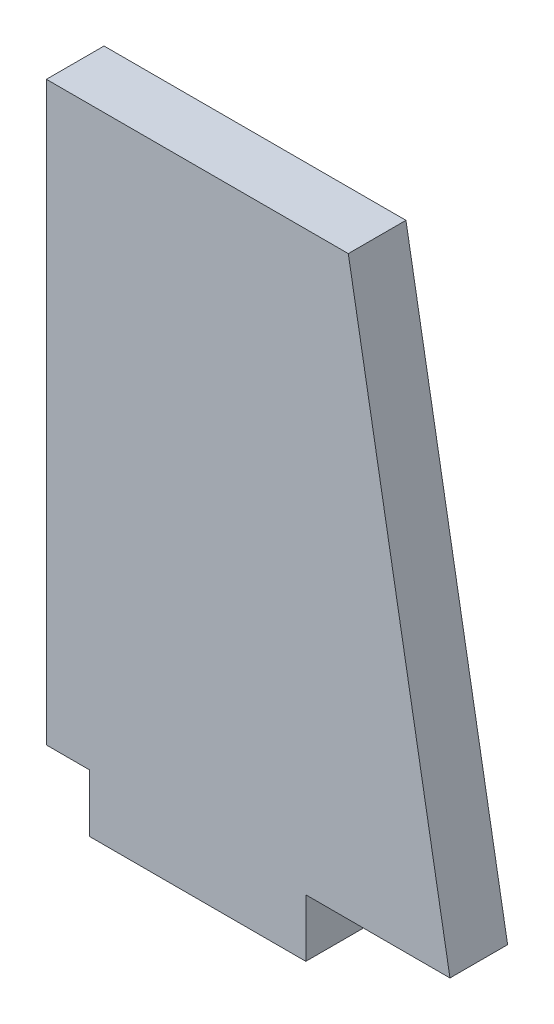
ISO-10303-21;
HEADER;
FILE_DESCRIPTION(('STEP AP214'),'2;1');
FILE_NAME('part.step','',(''),(''),'','','');
FILE_SCHEMA(('AUTOMOTIVE_DESIGN { 1 0 10303 214 1 1 1 1 }'));
ENDSEC;
DATA;
#1=APPLICATION_CONTEXT('core data for automotive mechanical design processes');
#2=APPLICATION_PROTOCOL_DEFINITION('international standard','automotive_design',2000,#1);
#3=PRODUCT_CONTEXT('',#1,'mechanical');
#4=PRODUCT('Part','Part','',(#3));
#5=PRODUCT_RELATED_PRODUCT_CATEGORY('part','',(#4));
#6=PRODUCT_DEFINITION_FORMATION('','',#4);
#7=PRODUCT_DEFINITION_CONTEXT('part definition',#1,'design');
#8=PRODUCT_DEFINITION('design','',#6,#7);
#9=PRODUCT_DEFINITION_SHAPE('','',#8);
#10=(LENGTH_UNIT() NAMED_UNIT(*) SI_UNIT(.MILLI.,.METRE.));
#11=(NAMED_UNIT(*) PLANE_ANGLE_UNIT() SI_UNIT($,.RADIAN.));
#12=(NAMED_UNIT(*) SI_UNIT($,.STERADIAN.) SOLID_ANGLE_UNIT());
#13=UNCERTAINTY_MEASURE_WITH_UNIT(LENGTH_MEASURE(1.E-05),#10,'distance_accuracy_value','');
#14=(GEOMETRIC_REPRESENTATION_CONTEXT(3) GLOBAL_UNCERTAINTY_ASSIGNED_CONTEXT((#13)) GLOBAL_UNIT_ASSIGNED_CONTEXT((#10,
#11,#12)) REPRESENTATION_CONTEXT('',''));
#15=CARTESIAN_POINT('',(0.,0.,0.));
#16=DIRECTION('',(0.,0.,1.));
#17=DIRECTION('',(1.,0.,0.));
#18=AXIS2_PLACEMENT_3D('',#15,#16,#17);
#19=CARTESIAN_POINT('',(-10.,0.,4.));
#20=DIRECTION('',(0.,1.,0.));
#21=DIRECTION('',(0.,0.,1.));
#22=AXIS2_PLACEMENT_3D('',#19,#20,#21);
#23=PLANE('',#22);
#24=DIRECTION('',(1.,0.,0.));
#25=VECTOR('',#24,1.);
#26=CARTESIAN_POINT('',(-10.,0.,0.));
#27=LINE('',#26,#25);
#28=CARTESIAN_POINT('',(-10.,0.,0.));
#29=VERTEX_POINT('',#28);
#30=CARTESIAN_POINT('',(0.,0.,0.));
#31=VERTEX_POINT('',#30);
#32=EDGE_CURVE('E129',#29,#31,#27,.T.);
#33=ORIENTED_EDGE('',*,*,#32,.T.);
#34=DIRECTION('',(0.,0.,-1.));
#35=VECTOR('',#34,1.);
#36=CARTESIAN_POINT('',(0.,0.,4.));
#37=LINE('',#36,#35);
#38=CARTESIAN_POINT('',(0.,0.,4.));
#39=VERTEX_POINT('',#38);
#40=EDGE_CURVE('E11',#39,#31,#37,.T.);
#41=ORIENTED_EDGE('',*,*,#40,.F.);
#42=DIRECTION('',(1.,0.,0.));
#43=VECTOR('',#42,1.);
#44=CARTESIAN_POINT('',(-10.,0.,4.));
#45=LINE('',#44,#43);
#46=CARTESIAN_POINT('',(-10.,0.,4.));
#47=VERTEX_POINT('',#46);
#48=EDGE_CURVE('E143',#47,#39,#45,.T.);
#49=ORIENTED_EDGE('',*,*,#48,.F.);
#50=DIRECTION('',(0.,0.,-1.));
#51=VECTOR('',#50,1.);
#52=CARTESIAN_POINT('',(-10.,0.,4.));
#53=LINE('',#52,#51);
#54=EDGE_CURVE('E125',#47,#29,#53,.T.);
#55=ORIENTED_EDGE('',*,*,#54,.T.);
#56=EDGE_LOOP('',(#33,#41,#49,#55));
#57=FACE_BOUND('',#56,.T.);
#58=ADVANCED_FACE('F33',(#57),#23,.F.);
#59=CARTESIAN_POINT('',(0.,0.,4.));
#60=DIRECTION('',(-0.984807753012207,-0.173648177666935,0.));
#61=DIRECTION('',(0.173648177666935,-0.984807753012207,0.));
#62=AXIS2_PLACEMENT_3D('',#59,#60,#61);
#63=PLANE('',#62);
#64=DIRECTION('',(-0.173648177666935,0.984807753012207,0.));
#65=VECTOR('',#64,1.);
#66=CARTESIAN_POINT('',(0.,0.,0.));
#67=LINE('',#66,#65);
#68=CARTESIAN_POINT('',(-7.05307922833878,40.,0.));
#69=VERTEX_POINT('',#68);
#70=EDGE_CURVE('E132',#31,#69,#67,.T.);
#71=ORIENTED_EDGE('',*,*,#70,.T.);
#72=DIRECTION('',(0.,0.,-1.));
#73=VECTOR('',#72,1.);
#74=CARTESIAN_POINT('',(-7.05307922833878,40.,4.));
#75=LINE('',#74,#73);
#76=CARTESIAN_POINT('',(-7.05307922833878,40.,4.));
#77=VERTEX_POINT('',#76);
#78=EDGE_CURVE('E41',#77,#69,#75,.T.);
#79=ORIENTED_EDGE('',*,*,#78,.F.);
#80=DIRECTION('',(-0.173648177666935,0.984807753012207,0.));
#81=VECTOR('',#80,1.);
#82=CARTESIAN_POINT('',(0.,0.,4.));
#83=LINE('',#82,#81);
#84=EDGE_CURVE('E92',#39,#77,#83,.T.);
#85=ORIENTED_EDGE('',*,*,#84,.F.);
#86=ORIENTED_EDGE('',*,*,#40,.T.);
#87=EDGE_LOOP('',(#71,#79,#85,#86));
#88=FACE_BOUND('',#87,.T.);
#89=ADVANCED_FACE('F178',(#88),#63,.F.);
#90=CARTESIAN_POINT('',(-7.05307922833878,40.,4.));
#91=DIRECTION('',(0.,-1.,0.));
#92=DIRECTION('',(0.,0.,-1.));
#93=AXIS2_PLACEMENT_3D('',#90,#91,#92);
#94=PLANE('',#93);
#95=DIRECTION('',(-1.,0.,0.));
#96=VECTOR('',#95,1.);
#97=CARTESIAN_POINT('',(-7.05307922833878,40.,0.));
#98=LINE('',#97,#96);
#99=CARTESIAN_POINT('',(-28.,40.,0.));
#100=VERTEX_POINT('',#99);
#101=EDGE_CURVE('E134',#69,#100,#98,.T.);
#102=ORIENTED_EDGE('',*,*,#101,.T.);
#103=DIRECTION('',(0.,0.,-1.));
#104=VECTOR('',#103,1.);
#105=CARTESIAN_POINT('',(-28.,40.,4.));
#106=LINE('',#105,#104);
#107=CARTESIAN_POINT('',(-28.,40.,4.));
#108=VERTEX_POINT('',#107);
#109=EDGE_CURVE('E150',#108,#100,#106,.T.);
#110=ORIENTED_EDGE('',*,*,#109,.F.);
#111=DIRECTION('',(-1.,0.,0.));
#112=VECTOR('',#111,1.);
#113=CARTESIAN_POINT('',(-7.05307922833878,40.,4.));
#114=LINE('',#113,#112);
#115=EDGE_CURVE('E158',#77,#108,#114,.T.);
#116=ORIENTED_EDGE('',*,*,#115,.F.);
#117=ORIENTED_EDGE('',*,*,#78,.T.);
#118=EDGE_LOOP('',(#102,#110,#116,#117));
#119=FACE_BOUND('',#118,.T.);
#120=ADVANCED_FACE('F156',(#119),#94,.F.);
#121=CARTESIAN_POINT('',(-28.,40.,4.));
#122=DIRECTION('',(1.,0.,0.));
#123=DIRECTION('',(0.,1.,0.));
#124=AXIS2_PLACEMENT_3D('',#121,#122,#123);
#125=PLANE('',#124);
#126=DIRECTION('',(0.,-1.,0.));
#127=VECTOR('',#126,1.);
#128=CARTESIAN_POINT('',(-28.,40.,0.));
#129=LINE('',#128,#127);
#130=CARTESIAN_POINT('',(-28.,0.,0.));
#131=VERTEX_POINT('',#130);
#132=EDGE_CURVE('E136',#100,#131,#129,.T.);
#133=ORIENTED_EDGE('',*,*,#132,.T.);
#134=DIRECTION('',(0.,0.,-1.));
#135=VECTOR('',#134,1.);
#136=CARTESIAN_POINT('',(-28.,0.,4.));
#137=LINE('',#136,#135);
#138=CARTESIAN_POINT('',(-28.,0.,4.));
#139=VERTEX_POINT('',#138);
#140=EDGE_CURVE('E147',#139,#131,#137,.T.);
#141=ORIENTED_EDGE('',*,*,#140,.F.);
#142=DIRECTION('',(0.,-1.,0.));
#143=VECTOR('',#142,1.);
#144=CARTESIAN_POINT('',(-28.,40.,4.));
#145=LINE('',#144,#143);
#146=EDGE_CURVE('E170',#108,#139,#145,.T.);
#147=ORIENTED_EDGE('',*,*,#146,.F.);
#148=ORIENTED_EDGE('',*,*,#109,.T.);
#149=EDGE_LOOP('',(#133,#141,#147,#148));
#150=FACE_BOUND('',#149,.T.);
#151=ADVANCED_FACE('F166',(#150),#125,.F.);
#152=CARTESIAN_POINT('',(-28.,0.,4.));
#153=DIRECTION('',(0.,1.,0.));
#154=DIRECTION('',(0.,0.,1.));
#155=AXIS2_PLACEMENT_3D('',#152,#153,#154);
#156=PLANE('',#155);
#157=DIRECTION('',(1.,0.,0.));
#158=VECTOR('',#157,1.);
#159=CARTESIAN_POINT('',(-28.,0.,0.));
#160=LINE('',#159,#158);
#161=CARTESIAN_POINT('',(-25.,0.,0.));
#162=VERTEX_POINT('',#161);
#163=EDGE_CURVE('E138',#131,#162,#160,.T.);
#164=ORIENTED_EDGE('',*,*,#163,.T.);
#165=DIRECTION('',(0.,0.,-1.));
#166=VECTOR('',#165,1.);
#167=CARTESIAN_POINT('',(-25.,0.,4.));
#168=LINE('',#167,#166);
#169=CARTESIAN_POINT('',(-25.,0.,4.));
#170=VERTEX_POINT('',#169);
#171=EDGE_CURVE('E120',#170,#162,#168,.T.);
#172=ORIENTED_EDGE('',*,*,#171,.F.);
#173=DIRECTION('',(1.,0.,0.));
#174=VECTOR('',#173,1.);
#175=CARTESIAN_POINT('',(-28.,0.,4.));
#176=LINE('',#175,#174);
#177=EDGE_CURVE('E111',#139,#170,#176,.T.);
#178=ORIENTED_EDGE('',*,*,#177,.F.);
#179=ORIENTED_EDGE('',*,*,#140,.T.);
#180=EDGE_LOOP('',(#164,#172,#178,#179));
#181=FACE_BOUND('',#180,.T.);
#182=ADVANCED_FACE('F169',(#181),#156,.F.);
#183=CARTESIAN_POINT('',(-25.,0.,4.));
#184=DIRECTION('',(1.,0.,0.));
#185=DIRECTION('',(0.,0.,-1.));
#186=AXIS2_PLACEMENT_3D('',#183,#184,#185);
#187=PLANE('',#186);
#188=DIRECTION('',(0.,-1.,0.));
#189=VECTOR('',#188,1.);
#190=CARTESIAN_POINT('',(-25.,0.,0.));
#191=LINE('',#190,#189);
#192=CARTESIAN_POINT('',(-25.,-4.,0.));
#193=VERTEX_POINT('',#192);
#194=EDGE_CURVE('E119',#162,#193,#191,.T.);
#195=ORIENTED_EDGE('',*,*,#194,.T.);
#196=DIRECTION('',(0.,0.,-1.));
#197=VECTOR('',#196,1.);
#198=CARTESIAN_POINT('',(-25.,-4.,4.));
#199=LINE('',#198,#197);
#200=CARTESIAN_POINT('',(-25.,-4.,4.));
#201=VERTEX_POINT('',#200);
#202=EDGE_CURVE('E116',#201,#193,#199,.T.);
#203=ORIENTED_EDGE('',*,*,#202,.F.);
#204=DIRECTION('',(0.,-1.,0.));
#205=VECTOR('',#204,1.);
#206=CARTESIAN_POINT('',(-25.,0.,4.));
#207=LINE('',#206,#205);
#208=EDGE_CURVE('E105',#170,#201,#207,.T.);
#209=ORIENTED_EDGE('',*,*,#208,.F.);
#210=ORIENTED_EDGE('',*,*,#171,.T.);
#211=EDGE_LOOP('',(#195,#203,#209,#210));
#212=FACE_BOUND('',#211,.T.);
#213=ADVANCED_FACE('F117',(#212),#187,.F.);
#214=CARTESIAN_POINT('',(-25.,-4.,4.));
#215=DIRECTION('',(0.,1.,0.));
#216=DIRECTION('',(0.,0.,1.));
#217=AXIS2_PLACEMENT_3D('',#214,#215,#216);
#218=PLANE('',#217);
#219=DIRECTION('',(1.,0.,0.));
#220=VECTOR('',#219,1.);
#221=CARTESIAN_POINT('',(-25.,-4.,0.));
#222=LINE('',#221,#220);
#223=CARTESIAN_POINT('',(-10.,-4.,0.));
#224=VERTEX_POINT('',#223);
#225=EDGE_CURVE('E78',#193,#224,#222,.T.);
#226=ORIENTED_EDGE('',*,*,#225,.T.);
#227=DIRECTION('',(0.,0.,-1.));
#228=VECTOR('',#227,1.);
#229=CARTESIAN_POINT('',(-10.,-4.,4.));
#230=LINE('',#229,#228);
#231=CARTESIAN_POINT('',(-10.,-4.,4.));
#232=VERTEX_POINT('',#231);
#233=EDGE_CURVE('E121',#232,#224,#230,.T.);
#234=ORIENTED_EDGE('',*,*,#233,.F.);
#235=DIRECTION('',(1.,0.,0.));
#236=VECTOR('',#235,1.);
#237=CARTESIAN_POINT('',(-25.,-4.,4.));
#238=LINE('',#237,#236);
#239=EDGE_CURVE('E109',#201,#232,#238,.T.);
#240=ORIENTED_EDGE('',*,*,#239,.F.);
#241=ORIENTED_EDGE('',*,*,#202,.T.);
#242=EDGE_LOOP('',(#226,#234,#240,#241));
#243=FACE_BOUND('',#242,.T.);
#244=ADVANCED_FACE('F123',(#243),#218,.F.);
#245=CARTESIAN_POINT('',(-10.,-4.,4.));
#246=DIRECTION('',(-1.,0.,0.));
#247=DIRECTION('',(0.,0.,1.));
#248=AXIS2_PLACEMENT_3D('',#245,#246,#247);
#249=PLANE('',#248);
#250=DIRECTION('',(0.,1.,0.));
#251=VECTOR('',#250,1.);
#252=CARTESIAN_POINT('',(-10.,-4.,0.));
#253=LINE('',#252,#251);
#254=EDGE_CURVE('E84',#224,#29,#253,.T.);
#255=ORIENTED_EDGE('',*,*,#254,.T.);
#256=ORIENTED_EDGE('',*,*,#54,.F.);
#257=DIRECTION('',(0.,1.,0.));
#258=VECTOR('',#257,1.);
#259=CARTESIAN_POINT('',(-10.,-4.,4.));
#260=LINE('',#259,#258);
#261=EDGE_CURVE('E49',#232,#47,#260,.T.);
#262=ORIENTED_EDGE('',*,*,#261,.F.);
#263=ORIENTED_EDGE('',*,*,#233,.T.);
#264=EDGE_LOOP('',(#255,#256,#262,#263));
#265=FACE_BOUND('',#264,.T.);
#266=ADVANCED_FACE('F194',(#265),#249,.F.);
#267=CARTESIAN_POINT('',(0.,0.,4.));
#268=DIRECTION('',(0.,0.,-1.));
#269=DIRECTION('',(-1.,0.,0.));
#270=AXIS2_PLACEMENT_3D('',#267,#268,#269);
#271=PLANE('',#270);
#272=ORIENTED_EDGE('',*,*,#48,.T.);
#273=ORIENTED_EDGE('',*,*,#84,.T.);
#274=ORIENTED_EDGE('',*,*,#115,.T.);
#275=ORIENTED_EDGE('',*,*,#146,.T.);
#276=ORIENTED_EDGE('',*,*,#177,.T.);
#277=ORIENTED_EDGE('',*,*,#208,.T.);
#278=ORIENTED_EDGE('',*,*,#239,.T.);
#279=ORIENTED_EDGE('',*,*,#261,.T.);
#280=EDGE_LOOP('',(#272,#273,#274,#275,#276,#277,#278,#279));
#281=FACE_BOUND('',#280,.T.);
#282=ADVANCED_FACE('F107',(#281),#271,.F.);
#283=CARTESIAN_POINT('',(0.,0.,0.));
#284=DIRECTION('',(0.,0.,-1.));
#285=DIRECTION('',(-1.,0.,0.));
#286=AXIS2_PLACEMENT_3D('',#283,#284,#285);
#287=PLANE('',#286);
#288=ORIENTED_EDGE('',*,*,#32,.F.);
#289=ORIENTED_EDGE('',*,*,#254,.F.);
#290=ORIENTED_EDGE('',*,*,#225,.F.);
#291=ORIENTED_EDGE('',*,*,#194,.F.);
#292=ORIENTED_EDGE('',*,*,#163,.F.);
#293=ORIENTED_EDGE('',*,*,#132,.F.);
#294=ORIENTED_EDGE('',*,*,#101,.F.);
#295=ORIENTED_EDGE('',*,*,#70,.F.);
#296=EDGE_LOOP('',(#288,#289,#290,#291,#292,#293,#294,#295));
#297=FACE_BOUND('',#296,.T.);
#298=ADVANCED_FACE('F162',(#297),#287,.T.);
#299=CLOSED_SHELL('',(#58,#89,#120,#151,#182,#213,#244,#266,#282,#298));
#300=MANIFOLD_SOLID_BREP('B2',#299);
#301=ADVANCED_BREP_SHAPE_REPRESENTATION('',(#18,#300),#14);
#302=SHAPE_DEFINITION_REPRESENTATION(#9,#301);
ENDSEC;
END-ISO-10303-21;
